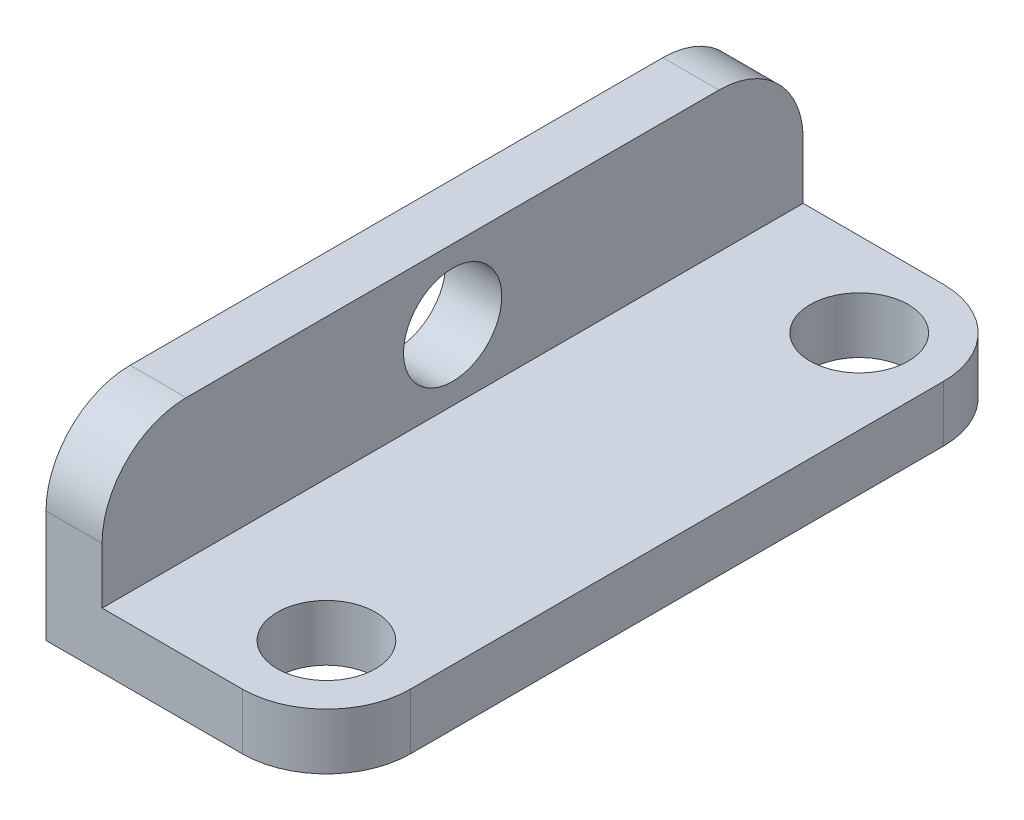
ISO-10303-21;
HEADER;
FILE_DESCRIPTION(('STEP AP214'),'2;1');
FILE_NAME('part.step','',(''),(''),'','','');
FILE_SCHEMA(('AUTOMOTIVE_DESIGN { 1 0 10303 214 1 1 1 1 }'));
ENDSEC;
DATA;
#1=APPLICATION_CONTEXT('core data for automotive mechanical design processes');
#2=APPLICATION_PROTOCOL_DEFINITION('international standard','automotive_design',2000,#1);
#3=PRODUCT_CONTEXT('',#1,'mechanical');
#4=PRODUCT('Part','Part','',(#3));
#5=PRODUCT_RELATED_PRODUCT_CATEGORY('part','',(#4));
#6=PRODUCT_DEFINITION_FORMATION('','',#4);
#7=PRODUCT_DEFINITION_CONTEXT('part definition',#1,'design');
#8=PRODUCT_DEFINITION('design','',#6,#7);
#9=PRODUCT_DEFINITION_SHAPE('','',#8);
#10=(LENGTH_UNIT() NAMED_UNIT(*) SI_UNIT(.MILLI.,.METRE.));
#11=(NAMED_UNIT(*) PLANE_ANGLE_UNIT() SI_UNIT($,.RADIAN.));
#12=(NAMED_UNIT(*) SI_UNIT($,.STERADIAN.) SOLID_ANGLE_UNIT());
#13=UNCERTAINTY_MEASURE_WITH_UNIT(LENGTH_MEASURE(1.E-05),#10,'distance_accuracy_value','');
#14=(GEOMETRIC_REPRESENTATION_CONTEXT(3) GLOBAL_UNCERTAINTY_ASSIGNED_CONTEXT((#13)) GLOBAL_UNIT_ASSIGNED_CONTEXT((#10,
#11,#12)) REPRESENTATION_CONTEXT('',''));
#15=CARTESIAN_POINT('',(0.,0.,0.));
#16=DIRECTION('',(0.,0.,1.));
#17=DIRECTION('',(1.,0.,0.));
#18=AXIS2_PLACEMENT_3D('',#15,#16,#17);
#19=CARTESIAN_POINT('',(5.,1.,12.5));
#20=DIRECTION('',(-1.,0.,0.));
#21=DIRECTION('',(0.,0.,1.));
#22=AXIS2_PLACEMENT_3D('',#19,#20,#21);
#23=PLANE('',#22);
#24=DIRECTION('',(0.,0.,-1.));
#25=VECTOR('',#24,1.);
#26=CARTESIAN_POINT('',(5.,1.,12.5));
#27=LINE('',#26,#25);
#28=CARTESIAN_POINT('',(5.,1.,9.5));
#29=VERTEX_POINT('',#28);
#30=CARTESIAN_POINT('',(5.,1.,-9.5));
#31=VERTEX_POINT('',#30);
#32=EDGE_CURVE('E138',#29,#31,#27,.T.);
#33=ORIENTED_EDGE('',*,*,#32,.F.);
#34=DIRECTION('',(0.,1.,0.));
#35=VECTOR('',#34,1.);
#36=CARTESIAN_POINT('',(5.,-1.,9.5));
#37=LINE('',#36,#35);
#38=CARTESIAN_POINT('',(5.,-1.,9.5));
#39=VERTEX_POINT('',#38);
#40=EDGE_CURVE('E198',#29,#39,#37,.F.);
#41=ORIENTED_EDGE('',*,*,#40,.T.);
#42=DIRECTION('',(0.,0.,-1.));
#43=VECTOR('',#42,1.);
#44=CARTESIAN_POINT('',(5.,-1.,12.5));
#45=LINE('',#44,#43);
#46=CARTESIAN_POINT('',(5.,-1.,-9.5));
#47=VERTEX_POINT('',#46);
#48=EDGE_CURVE('E154',#39,#47,#45,.T.);
#49=ORIENTED_EDGE('',*,*,#48,.T.);
#50=DIRECTION('',(0.,1.,0.));
#51=VECTOR('',#50,1.);
#52=CARTESIAN_POINT('',(5.,1.,-9.5));
#53=LINE('',#52,#51);
#54=EDGE_CURVE('E194',#47,#31,#53,.T.);
#55=ORIENTED_EDGE('',*,*,#54,.T.);
#56=EDGE_LOOP('',(#33,#41,#49,#55));
#57=FACE_BOUND('',#56,.T.);
#58=ADVANCED_FACE('F38',(#57),#23,.F.);
#59=CARTESIAN_POINT('',(-3.,1.,12.5));
#60=DIRECTION('',(0.,-1.,0.));
#61=DIRECTION('',(0.,0.,-1.));
#62=AXIS2_PLACEMENT_3D('',#59,#60,#61);
#63=PLANE('',#62);
#64=CARTESIAN_POINT('',(2.00000000000002,1.,9.5));
#65=DIRECTION('',(0.,1.,0.));
#66=DIRECTION('',(0.,0.,1.));
#67=AXIS2_PLACEMENT_3D('',#64,#65,#66);
#68=CIRCLE('',#67,1.75);
#69=CARTESIAN_POINT('',(2.00000000000002,1.,11.25));
#70=VERTEX_POINT('',#69);
#71=EDGE_CURVE('E338',#70,#70,#68,.T.);
#72=ORIENTED_EDGE('',*,*,#71,.F.);
#73=EDGE_LOOP('',(#72));
#74=FACE_BOUND('',#73,.T.);
#75=CARTESIAN_POINT('',(2.00000000000002,1.,-9.5));
#76=DIRECTION('',(0.,1.,0.));
#77=DIRECTION('',(0.,0.,-1.));
#78=AXIS2_PLACEMENT_3D('',#75,#76,#77);
#79=CIRCLE('',#78,1.75);
#80=CARTESIAN_POINT('',(2.00000000000002,1.,-11.25));
#81=VERTEX_POINT('',#80);
#82=EDGE_CURVE('E342',#81,#81,#79,.T.);
#83=ORIENTED_EDGE('',*,*,#82,.F.);
#84=EDGE_LOOP('',(#83));
#85=FACE_BOUND('',#84,.T.);
#86=DIRECTION('',(-1.,0.,0.));
#87=VECTOR('',#86,1.);
#88=CARTESIAN_POINT('',(-3.,1.,12.5));
#89=LINE('',#88,#87);
#90=CARTESIAN_POINT('',(2.,1.,12.5));
#91=VERTEX_POINT('',#90);
#92=CARTESIAN_POINT('',(-3.,1.,12.5));
#93=VERTEX_POINT('',#92);
#94=EDGE_CURVE('E117',#91,#93,#89,.T.);
#95=ORIENTED_EDGE('',*,*,#94,.F.);
#96=CARTESIAN_POINT('',(2.,1.,9.5));
#97=DIRECTION('',(0.,-1.,0.));
#98=DIRECTION('',(0.,0.,-1.));
#99=AXIS2_PLACEMENT_3D('',#96,#97,#98);
#100=CIRCLE('',#99,3.);
#101=EDGE_CURVE('E191',#91,#29,#100,.F.);
#102=ORIENTED_EDGE('',*,*,#101,.T.);
#103=ORIENTED_EDGE('',*,*,#32,.T.);
#104=CARTESIAN_POINT('',(2.,1.,-9.5));
#105=DIRECTION('',(0.,-1.,0.));
#106=DIRECTION('',(0.,0.,-1.));
#107=AXIS2_PLACEMENT_3D('',#104,#105,#106);
#108=CIRCLE('',#107,3.);
#109=CARTESIAN_POINT('',(2.,1.,-12.5));
#110=VERTEX_POINT('',#109);
#111=EDGE_CURVE('E188',#31,#110,#108,.F.);
#112=ORIENTED_EDGE('',*,*,#111,.T.);
#113=DIRECTION('',(-1.,0.,0.));
#114=VECTOR('',#113,1.);
#115=CARTESIAN_POINT('',(-3.,1.,-12.5));
#116=LINE('',#115,#114);
#117=CARTESIAN_POINT('',(-3.,1.,-12.5));
#118=VERTEX_POINT('',#117);
#119=EDGE_CURVE('E135',#110,#118,#116,.T.);
#120=ORIENTED_EDGE('',*,*,#119,.T.);
#121=DIRECTION('',(0.,0.,-1.));
#122=VECTOR('',#121,1.);
#123=CARTESIAN_POINT('',(-3.,1.,12.5));
#124=LINE('',#123,#122);
#125=EDGE_CURVE('E132',#93,#118,#124,.T.);
#126=ORIENTED_EDGE('',*,*,#125,.F.);
#127=EDGE_LOOP('',(#95,#102,#103,#112,#120,#126));
#128=FACE_BOUND('',#127,.T.);
#129=ADVANCED_FACE('F133',(#74,#85,#128),#63,.F.);
#130=CARTESIAN_POINT('',(-3.,1.,12.5));
#131=DIRECTION('',(-1.,0.,0.));
#132=DIRECTION('',(0.,0.,1.));
#133=AXIS2_PLACEMENT_3D('',#130,#131,#132);
#134=PLANE('',#133);
#135=CARTESIAN_POINT('',(-3.,3.5,0.));
#136=DIRECTION('',(1.,0.,0.));
#137=DIRECTION('',(0.,0.,-1.));
#138=AXIS2_PLACEMENT_3D('',#135,#136,#137);
#139=CIRCLE('',#138,1.75);
#140=CARTESIAN_POINT('',(-3.,3.5,-1.75));
#141=VERTEX_POINT('',#140);
#142=EDGE_CURVE('E327',#141,#141,#139,.T.);
#143=ORIENTED_EDGE('',*,*,#142,.F.);
#144=EDGE_LOOP('',(#143));
#145=FACE_BOUND('',#144,.T.);
#146=DIRECTION('',(0.,1.,0.));
#147=VECTOR('',#146,1.);
#148=CARTESIAN_POINT('',(-3.,1.,-12.5));
#149=LINE('',#148,#147);
#150=CARTESIAN_POINT('',(-3.,3.,-12.5));
#151=VERTEX_POINT('',#150);
#152=EDGE_CURVE('E157',#118,#151,#149,.T.);
#153=ORIENTED_EDGE('',*,*,#152,.T.);
#154=CARTESIAN_POINT('',(-3.,3.,-9.5));
#155=DIRECTION('',(-1.,0.,0.));
#156=DIRECTION('',(0.,0.,1.));
#157=AXIS2_PLACEMENT_3D('',#154,#155,#156);
#158=CIRCLE('',#157,3.);
#159=CARTESIAN_POINT('',(-3.,6.,-9.5));
#160=VERTEX_POINT('',#159);
#161=EDGE_CURVE('E11',#151,#160,#158,.F.);
#162=ORIENTED_EDGE('',*,*,#161,.T.);
#163=DIRECTION('',(0.,0.,-1.));
#164=VECTOR('',#163,1.);
#165=CARTESIAN_POINT('',(-3.,6.,12.5));
#166=LINE('',#165,#164);
#167=CARTESIAN_POINT('',(-3.,6.,9.5));
#168=VERTEX_POINT('',#167);
#169=EDGE_CURVE('E139',#168,#160,#166,.T.);
#170=ORIENTED_EDGE('',*,*,#169,.F.);
#171=CARTESIAN_POINT('',(-3.,3.,9.5));
#172=DIRECTION('',(-1.,0.,0.));
#173=DIRECTION('',(0.,0.,1.));
#174=AXIS2_PLACEMENT_3D('',#171,#172,#173);
#175=CIRCLE('',#174,3.);
#176=CARTESIAN_POINT('',(-3.,3.,12.5));
#177=VERTEX_POINT('',#176);
#178=EDGE_CURVE('E47',#168,#177,#175,.F.);
#179=ORIENTED_EDGE('',*,*,#178,.T.);
#180=DIRECTION('',(0.,1.,0.));
#181=VECTOR('',#180,1.);
#182=CARTESIAN_POINT('',(-3.,1.,12.5));
#183=LINE('',#182,#181);
#184=EDGE_CURVE('E123',#93,#177,#183,.T.);
#185=ORIENTED_EDGE('',*,*,#184,.F.);
#186=ORIENTED_EDGE('',*,*,#125,.T.);
#187=EDGE_LOOP('',(#153,#162,#170,#179,#185,#186));
#188=FACE_BOUND('',#187,.T.);
#189=ADVANCED_FACE('F141',(#145,#188),#134,.F.);
#190=CARTESIAN_POINT('',(-5.,6.,12.5));
#191=DIRECTION('',(0.,-1.,0.));
#192=DIRECTION('',(0.,0.,-1.));
#193=AXIS2_PLACEMENT_3D('',#190,#191,#192);
#194=PLANE('',#193);
#195=ORIENTED_EDGE('',*,*,#169,.T.);
#196=DIRECTION('',(-1.,0.,0.));
#197=VECTOR('',#196,1.);
#198=CARTESIAN_POINT('',(-5.,6.,-9.5));
#199=LINE('',#198,#197);
#200=CARTESIAN_POINT('',(-5.,6.,-9.5));
#201=VERTEX_POINT('',#200);
#202=EDGE_CURVE('E215',#160,#201,#199,.T.);
#203=ORIENTED_EDGE('',*,*,#202,.T.);
#204=DIRECTION('',(0.,0.,-1.));
#205=VECTOR('',#204,1.);
#206=CARTESIAN_POINT('',(-5.,6.,12.5));
#207=LINE('',#206,#205);
#208=CARTESIAN_POINT('',(-5.,6.,9.5));
#209=VERTEX_POINT('',#208);
#210=EDGE_CURVE('E174',#209,#201,#207,.T.);
#211=ORIENTED_EDGE('',*,*,#210,.F.);
#212=DIRECTION('',(-1.,0.,0.));
#213=VECTOR('',#212,1.);
#214=CARTESIAN_POINT('',(-3.,6.,9.5));
#215=LINE('',#214,#213);
#216=EDGE_CURVE('E59',#209,#168,#215,.F.);
#217=ORIENTED_EDGE('',*,*,#216,.T.);
#218=EDGE_LOOP('',(#195,#203,#211,#217));
#219=FACE_BOUND('',#218,.T.);
#220=ADVANCED_FACE('F260',(#219),#194,.F.);
#221=CARTESIAN_POINT('',(-5.,1.,12.5));
#222=DIRECTION('',(1.,0.,0.));
#223=DIRECTION('',(0.,0.,-1.));
#224=AXIS2_PLACEMENT_3D('',#221,#222,#223);
#225=PLANE('',#224);
#226=CARTESIAN_POINT('',(-5.,3.5,0.));
#227=DIRECTION('',(1.,0.,0.));
#228=DIRECTION('',(0.,0.,-1.));
#229=AXIS2_PLACEMENT_3D('',#226,#227,#228);
#230=CIRCLE('',#229,1.75);
#231=CARTESIAN_POINT('',(-5.,3.5,-1.75));
#232=VERTEX_POINT('',#231);
#233=EDGE_CURVE('E324',#232,#232,#230,.T.);
#234=ORIENTED_EDGE('',*,*,#233,.T.);
#235=EDGE_LOOP('',(#234));
#236=FACE_BOUND('',#235,.T.);
#237=ORIENTED_EDGE('',*,*,#210,.T.);
#238=CARTESIAN_POINT('',(-5.,3.,-9.5));
#239=DIRECTION('',(1.,0.,0.));
#240=DIRECTION('',(0.,0.,-1.));
#241=AXIS2_PLACEMENT_3D('',#238,#239,#240);
#242=CIRCLE('',#241,3.);
#243=CARTESIAN_POINT('',(-5.,3.,-12.5));
#244=VERTEX_POINT('',#243);
#245=EDGE_CURVE('E222',#201,#244,#242,.F.);
#246=ORIENTED_EDGE('',*,*,#245,.T.);
#247=DIRECTION('',(0.,-1.,0.));
#248=VECTOR('',#247,1.);
#249=CARTESIAN_POINT('',(-5.,1.,-12.5));
#250=LINE('',#249,#248);
#251=CARTESIAN_POINT('',(-5.,-1.,-12.5));
#252=VERTEX_POINT('',#251);
#253=EDGE_CURVE('E161',#244,#252,#250,.T.);
#254=ORIENTED_EDGE('',*,*,#253,.T.);
#255=DIRECTION('',(0.,0.,-1.));
#256=VECTOR('',#255,1.);
#257=CARTESIAN_POINT('',(-5.,-1.,12.5));
#258=LINE('',#257,#256);
#259=CARTESIAN_POINT('',(-5.,-1.,12.5));
#260=VERTEX_POINT('',#259);
#261=EDGE_CURVE('E170',#260,#252,#258,.T.);
#262=ORIENTED_EDGE('',*,*,#261,.F.);
#263=DIRECTION('',(0.,-1.,0.));
#264=VECTOR('',#263,1.);
#265=CARTESIAN_POINT('',(-5.,1.,12.5));
#266=LINE('',#265,#264);
#267=CARTESIAN_POINT('',(-5.,3.,12.5));
#268=VERTEX_POINT('',#267);
#269=EDGE_CURVE('E144',#268,#260,#266,.T.);
#270=ORIENTED_EDGE('',*,*,#269,.F.);
#271=CARTESIAN_POINT('',(-5.,3.,9.5));
#272=DIRECTION('',(1.,0.,0.));
#273=DIRECTION('',(0.,0.,-1.));
#274=AXIS2_PLACEMENT_3D('',#271,#272,#273);
#275=CIRCLE('',#274,3.);
#276=EDGE_CURVE('E219',#268,#209,#275,.F.);
#277=ORIENTED_EDGE('',*,*,#276,.T.);
#278=EDGE_LOOP('',(#237,#246,#254,#262,#270,#277));
#279=FACE_BOUND('',#278,.T.);
#280=ADVANCED_FACE('F251',(#236,#279),#225,.F.);
#281=CARTESIAN_POINT('',(-5.,-1.,12.5));
#282=DIRECTION('',(0.,1.,0.));
#283=DIRECTION('',(0.,0.,1.));
#284=AXIS2_PLACEMENT_3D('',#281,#282,#283);
#285=PLANE('',#284);
#286=CARTESIAN_POINT('',(2.00000000000002,-1.,9.5));
#287=DIRECTION('',(0.,1.,0.));
#288=DIRECTION('',(0.,0.,1.));
#289=AXIS2_PLACEMENT_3D('',#286,#287,#288);
#290=CIRCLE('',#289,1.75);
#291=CARTESIAN_POINT('',(2.00000000000002,-1.,11.25));
#292=VERTEX_POINT('',#291);
#293=EDGE_CURVE('E158',#292,#292,#290,.T.);
#294=ORIENTED_EDGE('',*,*,#293,.T.);
#295=EDGE_LOOP('',(#294));
#296=FACE_BOUND('',#295,.T.);
#297=CARTESIAN_POINT('',(2.00000000000002,-1.,-9.5));
#298=DIRECTION('',(0.,1.,0.));
#299=DIRECTION('',(0.,0.,-1.));
#300=AXIS2_PLACEMENT_3D('',#297,#298,#299);
#301=CIRCLE('',#300,1.75);
#302=CARTESIAN_POINT('',(2.00000000000002,-1.,-11.25));
#303=VERTEX_POINT('',#302);
#304=EDGE_CURVE('E332',#303,#303,#301,.T.);
#305=ORIENTED_EDGE('',*,*,#304,.T.);
#306=EDGE_LOOP('',(#305));
#307=FACE_BOUND('',#306,.T.);
#308=ORIENTED_EDGE('',*,*,#48,.F.);
#309=CARTESIAN_POINT('',(2.,-1.,9.5));
#310=DIRECTION('',(0.,1.,0.));
#311=DIRECTION('',(0.,0.,1.));
#312=AXIS2_PLACEMENT_3D('',#309,#310,#311);
#313=CIRCLE('',#312,3.);
#314=CARTESIAN_POINT('',(2.,-1.,12.5));
#315=VERTEX_POINT('',#314);
#316=EDGE_CURVE('E204',#39,#315,#313,.F.);
#317=ORIENTED_EDGE('',*,*,#316,.T.);
#318=DIRECTION('',(1.,0.,0.));
#319=VECTOR('',#318,1.);
#320=CARTESIAN_POINT('',(-5.,-1.,12.5));
#321=LINE('',#320,#319);
#322=EDGE_CURVE('E148',#260,#315,#321,.T.);
#323=ORIENTED_EDGE('',*,*,#322,.F.);
#324=ORIENTED_EDGE('',*,*,#261,.T.);
#325=DIRECTION('',(1.,0.,0.));
#326=VECTOR('',#325,1.);
#327=CARTESIAN_POINT('',(-5.,-1.,-12.5));
#328=LINE('',#327,#326);
#329=CARTESIAN_POINT('',(2.,-1.,-12.5));
#330=VERTEX_POINT('',#329);
#331=EDGE_CURVE('E129',#252,#330,#328,.T.);
#332=ORIENTED_EDGE('',*,*,#331,.T.);
#333=CARTESIAN_POINT('',(2.,-1.,-9.5));
#334=DIRECTION('',(0.,1.,0.));
#335=DIRECTION('',(0.,0.,1.));
#336=AXIS2_PLACEMENT_3D('',#333,#334,#335);
#337=CIRCLE('',#336,3.);
#338=EDGE_CURVE('E201',#330,#47,#337,.F.);
#339=ORIENTED_EDGE('',*,*,#338,.T.);
#340=EDGE_LOOP('',(#308,#317,#323,#324,#332,#339));
#341=FACE_BOUND('',#340,.T.);
#342=ADVANCED_FACE('F266',(#296,#307,#341),#285,.F.);
#343=CARTESIAN_POINT('',(0.,0.,12.5));
#344=DIRECTION('',(0.,0.,1.));
#345=DIRECTION('',(1.,0.,0.));
#346=AXIS2_PLACEMENT_3D('',#343,#344,#345);
#347=PLANE('',#346);
#348=ORIENTED_EDGE('',*,*,#322,.T.);
#349=DIRECTION('',(0.,1.,0.));
#350=VECTOR('',#349,1.);
#351=CARTESIAN_POINT('',(2.,1.,12.5));
#352=LINE('',#351,#350);
#353=EDGE_CURVE('E126',#315,#91,#352,.T.);
#354=ORIENTED_EDGE('',*,*,#353,.T.);
#355=ORIENTED_EDGE('',*,*,#94,.T.);
#356=ORIENTED_EDGE('',*,*,#184,.T.);
#357=DIRECTION('',(-1.,0.,0.));
#358=VECTOR('',#357,1.);
#359=CARTESIAN_POINT('',(-5.,3.,12.5));
#360=LINE('',#359,#358);
#361=EDGE_CURVE('E183',#177,#268,#360,.T.);
#362=ORIENTED_EDGE('',*,*,#361,.T.);
#363=ORIENTED_EDGE('',*,*,#269,.T.);
#364=EDGE_LOOP('',(#348,#354,#355,#356,#362,#363));
#365=FACE_BOUND('',#364,.T.);
#366=ADVANCED_FACE('F120',(#365),#347,.T.);
#367=CARTESIAN_POINT('',(0.,0.,-12.5));
#368=DIRECTION('',(0.,0.,1.));
#369=DIRECTION('',(1.,0.,0.));
#370=AXIS2_PLACEMENT_3D('',#367,#368,#369);
#371=PLANE('',#370);
#372=ORIENTED_EDGE('',*,*,#119,.F.);
#373=DIRECTION('',(0.,1.,0.));
#374=VECTOR('',#373,1.);
#375=CARTESIAN_POINT('',(2.,0.,-12.5));
#376=LINE('',#375,#374);
#377=EDGE_CURVE('E210',#110,#330,#376,.F.);
#378=ORIENTED_EDGE('',*,*,#377,.T.);
#379=ORIENTED_EDGE('',*,*,#331,.F.);
#380=ORIENTED_EDGE('',*,*,#253,.F.);
#381=DIRECTION('',(-1.,0.,0.));
#382=VECTOR('',#381,1.);
#383=CARTESIAN_POINT('',(0.,3.,-12.5));
#384=LINE('',#383,#382);
#385=EDGE_CURVE('E207',#244,#151,#384,.F.);
#386=ORIENTED_EDGE('',*,*,#385,.T.);
#387=ORIENTED_EDGE('',*,*,#152,.F.);
#388=EDGE_LOOP('',(#372,#378,#379,#380,#386,#387));
#389=FACE_BOUND('',#388,.T.);
#390=ADVANCED_FACE('F258',(#389),#371,.F.);
#391=CARTESIAN_POINT('',(2.,0.,9.5));
#392=DIRECTION('',(0.,-1.,0.));
#393=DIRECTION('',(0.,0.,-1.));
#394=AXIS2_PLACEMENT_3D('',#391,#392,#393);
#395=CYLINDRICAL_SURFACE('',#394,3.);
#396=ORIENTED_EDGE('',*,*,#316,.F.);
#397=ORIENTED_EDGE('',*,*,#40,.F.);
#398=ORIENTED_EDGE('',*,*,#101,.F.);
#399=ORIENTED_EDGE('',*,*,#353,.F.);
#400=EDGE_LOOP('',(#396,#397,#398,#399));
#401=FACE_BOUND('',#400,.T.);
#402=ADVANCED_FACE('F269',(#401),#395,.T.);
#403=CARTESIAN_POINT('',(2.,1.,-9.5));
#404=DIRECTION('',(0.,1.,0.));
#405=DIRECTION('',(0.,0.,1.));
#406=AXIS2_PLACEMENT_3D('',#403,#404,#405);
#407=CYLINDRICAL_SURFACE('',#406,3.);
#408=ORIENTED_EDGE('',*,*,#338,.F.);
#409=ORIENTED_EDGE('',*,*,#377,.F.);
#410=ORIENTED_EDGE('',*,*,#111,.F.);
#411=ORIENTED_EDGE('',*,*,#54,.F.);
#412=EDGE_LOOP('',(#408,#409,#410,#411));
#413=FACE_BOUND('',#412,.T.);
#414=ADVANCED_FACE('F276',(#413),#407,.T.);
#415=CARTESIAN_POINT('',(-5.,3.,-9.5));
#416=DIRECTION('',(-1.,0.,0.));
#417=DIRECTION('',(0.,0.,1.));
#418=AXIS2_PLACEMENT_3D('',#415,#416,#417);
#419=CYLINDRICAL_SURFACE('',#418,3.);
#420=ORIENTED_EDGE('',*,*,#161,.F.);
#421=ORIENTED_EDGE('',*,*,#385,.F.);
#422=ORIENTED_EDGE('',*,*,#245,.F.);
#423=ORIENTED_EDGE('',*,*,#202,.F.);
#424=EDGE_LOOP('',(#420,#421,#422,#423));
#425=FACE_BOUND('',#424,.T.);
#426=ADVANCED_FACE('F259',(#425),#419,.T.);
#427=CARTESIAN_POINT('',(0.,3.,9.5));
#428=DIRECTION('',(1.,0.,0.));
#429=DIRECTION('',(0.,0.,-1.));
#430=AXIS2_PLACEMENT_3D('',#427,#428,#429);
#431=CYLINDRICAL_SURFACE('',#430,3.);
#432=ORIENTED_EDGE('',*,*,#178,.F.);
#433=ORIENTED_EDGE('',*,*,#216,.F.);
#434=ORIENTED_EDGE('',*,*,#276,.F.);
#435=ORIENTED_EDGE('',*,*,#361,.F.);
#436=EDGE_LOOP('',(#432,#433,#434,#435));
#437=FACE_BOUND('',#436,.T.);
#438=ADVANCED_FACE('F40',(#437),#431,.T.);
#439=CARTESIAN_POINT('',(2.00000000000002,-1.,-9.5));
#440=DIRECTION('',(0.,1.,0.));
#441=DIRECTION('',(0.,0.,1.));
#442=AXIS2_PLACEMENT_3D('',#439,#440,#441);
#443=CYLINDRICAL_SURFACE('',#442,1.75);
#444=ORIENTED_EDGE('',*,*,#304,.F.);
#445=EDGE_LOOP('',(#444));
#446=FACE_BOUND('',#445,.T.);
#447=ORIENTED_EDGE('',*,*,#82,.T.);
#448=EDGE_LOOP('',(#447));
#449=FACE_BOUND('',#448,.T.);
#450=ADVANCED_FACE('F308',(#446,#449),#443,.F.);
#451=CARTESIAN_POINT('',(2.00000000000002,-1.,9.5));
#452=DIRECTION('',(0.,1.,0.));
#453=DIRECTION('',(0.,0.,1.));
#454=AXIS2_PLACEMENT_3D('',#451,#452,#453);
#455=CYLINDRICAL_SURFACE('',#454,1.75);
#456=ORIENTED_EDGE('',*,*,#293,.F.);
#457=EDGE_LOOP('',(#456));
#458=FACE_BOUND('',#457,.T.);
#459=ORIENTED_EDGE('',*,*,#71,.T.);
#460=EDGE_LOOP('',(#459));
#461=FACE_BOUND('',#460,.T.);
#462=ADVANCED_FACE('F311',(#458,#461),#455,.F.);
#463=CARTESIAN_POINT('',(-5.,3.5,0.));
#464=DIRECTION('',(1.,0.,0.));
#465=DIRECTION('',(0.,0.,-1.));
#466=AXIS2_PLACEMENT_3D('',#463,#464,#465);
#467=CYLINDRICAL_SURFACE('',#466,1.75);
#468=ORIENTED_EDGE('',*,*,#233,.F.);
#469=EDGE_LOOP('',(#468));
#470=FACE_BOUND('',#469,.T.);
#471=ORIENTED_EDGE('',*,*,#142,.T.);
#472=EDGE_LOOP('',(#471));
#473=FACE_BOUND('',#472,.T.);
#474=ADVANCED_FACE('F315',(#470,#473),#467,.F.);
#475=CLOSED_SHELL('',(#58,#129,#189,#220,#280,#342,#366,#390,#402,#414,#426,#438,#450,#462,#474));
#476=MANIFOLD_SOLID_BREP('B2',#475);
#477=ADVANCED_BREP_SHAPE_REPRESENTATION('',(#18,#476),#14);
#478=SHAPE_DEFINITION_REPRESENTATION(#9,#477);
ENDSEC;
END-ISO-10303-21;
